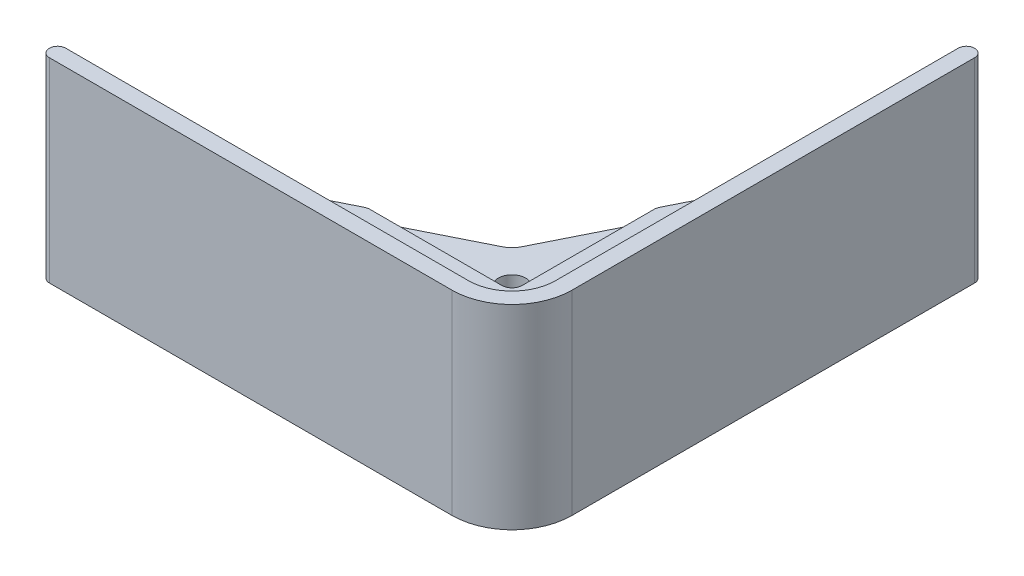
ISO-10303-21;
HEADER;
FILE_DESCRIPTION(('STEP AP214'),'2;1');
FILE_NAME('part.step','',(''),(''),'','','');
FILE_SCHEMA(('AUTOMOTIVE_DESIGN { 1 0 10303 214 1 1 1 1 }'));
ENDSEC;
DATA;
#1=APPLICATION_CONTEXT('core data for automotive mechanical design processes');
#2=APPLICATION_PROTOCOL_DEFINITION('international standard','automotive_design',2000,#1);
#3=PRODUCT_CONTEXT('',#1,'mechanical');
#4=PRODUCT('Part','Part','',(#3));
#5=PRODUCT_RELATED_PRODUCT_CATEGORY('part','',(#4));
#6=PRODUCT_DEFINITION_FORMATION('','',#4);
#7=PRODUCT_DEFINITION_CONTEXT('part definition',#1,'design');
#8=PRODUCT_DEFINITION('design','',#6,#7);
#9=PRODUCT_DEFINITION_SHAPE('','',#8);
#10=(LENGTH_UNIT() NAMED_UNIT(*) SI_UNIT(.MILLI.,.METRE.));
#11=(NAMED_UNIT(*) PLANE_ANGLE_UNIT() SI_UNIT($,.RADIAN.));
#12=(NAMED_UNIT(*) SI_UNIT($,.STERADIAN.) SOLID_ANGLE_UNIT());
#13=UNCERTAINTY_MEASURE_WITH_UNIT(LENGTH_MEASURE(1.E-05),#10,'distance_accuracy_value','');
#14=(GEOMETRIC_REPRESENTATION_CONTEXT(3) GLOBAL_UNCERTAINTY_ASSIGNED_CONTEXT((#13)) GLOBAL_UNIT_ASSIGNED_CONTEXT((#10,
#11,#12)) REPRESENTATION_CONTEXT('',''));
#15=CARTESIAN_POINT('',(0.,0.,0.));
#16=DIRECTION('',(0.,0.,1.));
#17=DIRECTION('',(1.,0.,0.));
#18=AXIS2_PLACEMENT_3D('',#15,#16,#17);
#19=CARTESIAN_POINT('',(0.,50.8,0.));
#20=DIRECTION('',(0.,-1.,0.));
#21=DIRECTION('',(0.,0.,-1.));
#22=AXIS2_PLACEMENT_3D('',#19,#20,#21);
#23=CYLINDRICAL_SURFACE('',#22,4.28625);
#24=CARTESIAN_POINT('',(0.,0.,0.));
#25=DIRECTION('',(0.,1.,0.));
#26=DIRECTION('',(0.,0.,1.));
#27=AXIS2_PLACEMENT_3D('',#24,#25,#26);
#28=CIRCLE('',#27,4.28625);
#29=CARTESIAN_POINT('',(0.,0.,4.28625));
#30=VERTEX_POINT('',#29);
#31=EDGE_CURVE('E287',#30,#30,#28,.T.);
#32=ORIENTED_EDGE('',*,*,#31,.F.);
#33=EDGE_LOOP('',(#32));
#34=FACE_BOUND('',#33,.T.);
#35=CARTESIAN_POINT('',(0.,47.371,0.));
#36=DIRECTION('',(0.,1.,0.));
#37=DIRECTION('',(0.,0.,1.));
#38=AXIS2_PLACEMENT_3D('',#35,#36,#37);
#39=CIRCLE('',#38,4.28625);
#40=CARTESIAN_POINT('',(0.,47.371,4.28625));
#41=VERTEX_POINT('',#40);
#42=EDGE_CURVE('E273',#41,#41,#39,.T.);
#43=ORIENTED_EDGE('',*,*,#42,.T.);
#44=EDGE_LOOP('',(#43));
#45=FACE_BOUND('',#44,.T.);
#46=ADVANCED_FACE('F39',(#34,#45),#23,.F.);
#47=CARTESIAN_POINT('',(-12.0476063758865,50.8,-6.00671496008418));
#48=DIRECTION('',(-0.894934361602028,0.,-0.446197813109804));
#49=DIRECTION('',(-0.446197813109804,0.,0.894934361602028));
#50=AXIS2_PLACEMENT_3D('',#47,#48,#49);
#51=PLANE('',#50);
#52=DIRECTION('',(0.446197813109804,0.,-0.894934361602028));
#53=VECTOR('',#52,1.);
#54=CARTESIAN_POINT('',(-12.0476063758865,0.,-6.00671496008418));
#55=LINE('',#54,#53);
#56=CARTESIAN_POINT('',(-9.08975997068408,0.,-11.9392370536097));
#57=VERTEX_POINT('',#56);
#58=CARTESIAN_POINT('',(12.7948331961729,0.,-55.832940337811));
#59=VERTEX_POINT('',#58);
#60=EDGE_CURVE('E282',#57,#59,#55,.T.);
#61=ORIENTED_EDGE('',*,*,#60,.F.);
#62=DIRECTION('',(0.,-1.,0.));
#63=VECTOR('',#62,1.);
#64=CARTESIAN_POINT('',(-9.08975997068408,50.8,-11.9392370536097));
#65=LINE('',#64,#63);
#66=CARTESIAN_POINT('',(-9.08975997068408,47.371,-11.9392370536097));
#67=VERTEX_POINT('',#66);
#68=EDGE_CURVE('E346',#57,#67,#65,.F.);
#69=ORIENTED_EDGE('',*,*,#68,.T.);
#70=DIRECTION('',(0.446197813109804,0.,-0.894934361602028));
#71=VECTOR('',#70,1.);
#72=CARTESIAN_POINT('',(-12.0476063758865,47.371,-6.00671496008418));
#73=LINE('',#72,#71);
#74=CARTESIAN_POINT('',(5.15958340191356,47.371,-40.5189984054781));
#75=VERTEX_POINT('',#74);
#76=EDGE_CURVE('E280',#67,#75,#73,.T.);
#77=ORIENTED_EDGE('',*,*,#76,.T.);
#78=DIRECTION('',(0.,1.,0.));
#79=VECTOR('',#78,1.);
#80=CARTESIAN_POINT('',(5.15958340191356,50.8,-40.5189984054781));
#81=LINE('',#80,#79);
#82=CARTESIAN_POINT('',(5.15958340191356,50.8,-40.5189984054781));
#83=VERTEX_POINT('',#82);
#84=EDGE_CURVE('E198',#75,#83,#81,.T.);
#85=ORIENTED_EDGE('',*,*,#84,.T.);
#86=DIRECTION('',(0.446197813109804,0.,-0.894934361602028));
#87=VECTOR('',#86,1.);
#88=CARTESIAN_POINT('',(-12.0476063758865,50.8,-6.00671496008418));
#89=LINE('',#88,#87);
#90=CARTESIAN_POINT('',(12.7948331961729,50.8,-55.832940337811));
#91=VERTEX_POINT('',#90);
#92=EDGE_CURVE('E283',#83,#91,#89,.T.);
#93=ORIENTED_EDGE('',*,*,#92,.T.);
#94=DIRECTION('',(0.,-1.,0.));
#95=VECTOR('',#94,1.);
#96=CARTESIAN_POINT('',(12.7948331961729,0.,-55.832940337811));
#97=LINE('',#96,#95);
#98=EDGE_CURVE('E343',#91,#59,#97,.T.);
#99=ORIENTED_EDGE('',*,*,#98,.T.);
#100=EDGE_LOOP('',(#61,#69,#77,#85,#93,#99));
#101=FACE_BOUND('',#100,.T.);
#102=ADVANCED_FACE('F409',(#101),#51,.T.);
#103=CARTESIAN_POINT('',(-6.00671496008417,50.8,-12.0476063758865));
#104=DIRECTION('',(0.446197813109803,0.,0.894934361602028));
#105=DIRECTION('',(0.894934361602028,0.,-0.446197813109804));
#106=AXIS2_PLACEMENT_3D('',#103,#104,#105);
#107=PLANE('',#106);
#108=DIRECTION('',(-0.894934361602028,0.,0.446197813109804));
#109=VECTOR('',#108,1.);
#110=CARTESIAN_POINT('',(-6.00671496008417,47.371,-12.0476063758865));
#111=LINE('',#110,#109);
#112=CARTESIAN_POINT('',(-11.9392370536097,47.371,-9.08975997068407));
#113=VERTEX_POINT('',#112);
#114=CARTESIAN_POINT('',(-40.5189984054781,47.371,5.15958340191357));
#115=VERTEX_POINT('',#114);
#116=EDGE_CURVE('E278',#113,#115,#111,.T.);
#117=ORIENTED_EDGE('',*,*,#116,.F.);
#118=DIRECTION('',(0.,-1.,0.));
#119=VECTOR('',#118,1.);
#120=CARTESIAN_POINT('',(-11.9392370536097,50.8,-9.08975997068407));
#121=LINE('',#120,#119);
#122=CARTESIAN_POINT('',(-11.9392370536097,0.,-9.08975997068407));
#123=VERTEX_POINT('',#122);
#124=EDGE_CURVE('E340',#113,#123,#121,.T.);
#125=ORIENTED_EDGE('',*,*,#124,.T.);
#126=DIRECTION('',(-0.894934361602028,0.,0.446197813109804));
#127=VECTOR('',#126,1.);
#128=CARTESIAN_POINT('',(-6.00671496008417,0.,-12.0476063758865));
#129=LINE('',#128,#127);
#130=CARTESIAN_POINT('',(-55.832940337811,0.,12.7948331961729));
#131=VERTEX_POINT('',#130);
#132=EDGE_CURVE('E293',#123,#131,#129,.T.);
#133=ORIENTED_EDGE('',*,*,#132,.T.);
#134=DIRECTION('',(0.,-1.,0.));
#135=VECTOR('',#134,1.);
#136=CARTESIAN_POINT('',(-55.832940337811,50.8,12.7948331961729));
#137=LINE('',#136,#135);
#138=CARTESIAN_POINT('',(-55.832940337811,50.8,12.7948331961729));
#139=VERTEX_POINT('',#138);
#140=EDGE_CURVE('E338',#131,#139,#137,.F.);
#141=ORIENTED_EDGE('',*,*,#140,.T.);
#142=DIRECTION('',(-0.894934361602028,0.,0.446197813109804));
#143=VECTOR('',#142,1.);
#144=CARTESIAN_POINT('',(-6.00671496008417,50.8,-12.0476063758865));
#145=LINE('',#144,#143);
#146=CARTESIAN_POINT('',(-40.5189984054781,50.8,5.15958340191357));
#147=VERTEX_POINT('',#146);
#148=EDGE_CURVE('E286',#147,#139,#145,.T.);
#149=ORIENTED_EDGE('',*,*,#148,.F.);
#150=DIRECTION('',(0.,1.,0.));
#151=VECTOR('',#150,1.);
#152=CARTESIAN_POINT('',(-40.5189984054781,50.8,5.15958340191357));
#153=LINE('',#152,#151);
#154=EDGE_CURVE('E325',#147,#115,#153,.F.);
#155=ORIENTED_EDGE('',*,*,#154,.T.);
#156=EDGE_LOOP('',(#117,#125,#133,#141,#149,#155));
#157=FACE_BOUND('',#156,.T.);
#158=ADVANCED_FACE('F401',(#157),#107,.F.);
#159=CARTESIAN_POINT('',(0.,50.8,13.462));
#160=DIRECTION('',(0.,0.,-1.));
#161=DIRECTION('',(-1.,0.,0.));
#162=AXIS2_PLACEMENT_3D('',#159,#160,#161);
#163=PLANE('',#162);
#164=DIRECTION('',(0.,-1.,0.));
#165=VECTOR('',#164,1.);
#166=CARTESIAN_POINT('',(-58.6662964510583,50.8,13.462));
#167=LINE('',#166,#165);
#168=CARTESIAN_POINT('',(-58.6662964510583,50.8,13.462));
#169=VERTEX_POINT('',#168);
#170=CARTESIAN_POINT('',(-58.6662964510583,0.,13.462));
#171=VERTEX_POINT('',#170);
#172=EDGE_CURVE('E348',#169,#171,#167,.T.);
#173=ORIENTED_EDGE('',*,*,#172,.T.);
#174=DIRECTION('',(1.,0.,0.));
#175=VECTOR('',#174,1.);
#176=CARTESIAN_POINT('',(0.,0.,13.462));
#177=LINE('',#176,#175);
#178=CARTESIAN_POINT('',(0.,0.,13.462));
#179=VERTEX_POINT('',#178);
#180=EDGE_CURVE('E256',#171,#179,#177,.T.);
#181=ORIENTED_EDGE('',*,*,#180,.T.);
#182=DIRECTION('',(0.,-1.,0.));
#183=VECTOR('',#182,1.);
#184=CARTESIAN_POINT('',(0.,55.5625,13.462));
#185=LINE('',#184,#183);
#186=CARTESIAN_POINT('',(0.,-4.7625,13.462));
#187=VERTEX_POINT('',#186);
#188=EDGE_CURVE('E229',#179,#187,#185,.T.);
#189=ORIENTED_EDGE('',*,*,#188,.T.);
#190=DIRECTION('',(-1.,0.,0.));
#191=VECTOR('',#190,1.);
#192=CARTESIAN_POINT('',(0.,-4.7625,13.462));
#193=LINE('',#192,#191);
#194=CARTESIAN_POINT('',(-124.46,-4.7625,13.462));
#195=VERTEX_POINT('',#194);
#196=EDGE_CURVE('E214',#187,#195,#193,.T.);
#197=ORIENTED_EDGE('',*,*,#196,.T.);
#198=DIRECTION('',(0.,-1.,0.));
#199=VECTOR('',#198,1.);
#200=CARTESIAN_POINT('',(-124.46,50.8,13.462));
#201=LINE('',#200,#199);
#202=CARTESIAN_POINT('',(-124.46,55.5625,13.462));
#203=VERTEX_POINT('',#202);
#204=EDGE_CURVE('E199',#195,#203,#201,.F.);
#205=ORIENTED_EDGE('',*,*,#204,.T.);
#206=DIRECTION('',(-1.,0.,0.));
#207=VECTOR('',#206,1.);
#208=CARTESIAN_POINT('',(0.,55.5625,13.462));
#209=LINE('',#208,#207);
#210=CARTESIAN_POINT('',(0.,55.5625,13.462));
#211=VERTEX_POINT('',#210);
#212=EDGE_CURVE('E212',#211,#203,#209,.T.);
#213=ORIENTED_EDGE('',*,*,#212,.F.);
#214=CARTESIAN_POINT('',(0.,50.8,13.462));
#215=VERTEX_POINT('',#214);
#216=EDGE_CURVE('E249',#211,#215,#185,.T.);
#217=ORIENTED_EDGE('',*,*,#216,.T.);
#218=DIRECTION('',(1.,0.,0.));
#219=VECTOR('',#218,1.);
#220=CARTESIAN_POINT('',(0.,50.8,13.462));
#221=LINE('',#220,#219);
#222=EDGE_CURVE('E259',#169,#215,#221,.T.);
#223=ORIENTED_EDGE('',*,*,#222,.F.);
#224=EDGE_LOOP('',(#173,#181,#189,#197,#205,#213,#217,#223));
#225=FACE_BOUND('',#224,.T.);
#226=ADVANCED_FACE('F392',(#225),#163,.T.);
#227=CARTESIAN_POINT('',(0.,50.8,18.542));
#228=DIRECTION('',(0.,0.,1.));
#229=DIRECTION('',(1.,0.,0.));
#230=AXIS2_PLACEMENT_3D('',#227,#228,#229);
#231=PLANE('',#230);
#232=DIRECTION('',(0.,-1.,0.));
#233=VECTOR('',#232,1.);
#234=CARTESIAN_POINT('',(0.,50.8,18.542));
#235=LINE('',#234,#233);
#236=CARTESIAN_POINT('',(0.,55.5625,18.542));
#237=VERTEX_POINT('',#236);
#238=CARTESIAN_POINT('',(0.,-4.7625,18.542));
#239=VERTEX_POINT('',#238);
#240=EDGE_CURVE('E204',#237,#239,#235,.T.);
#241=ORIENTED_EDGE('',*,*,#240,.F.);
#242=DIRECTION('',(1.,0.,0.));
#243=VECTOR('',#242,1.);
#244=CARTESIAN_POINT('',(-124.46,55.5625,18.542));
#245=LINE('',#244,#243);
#246=CARTESIAN_POINT('',(-124.46,55.5625,18.542));
#247=VERTEX_POINT('',#246);
#248=EDGE_CURVE('E202',#247,#237,#245,.T.);
#249=ORIENTED_EDGE('',*,*,#248,.F.);
#250=DIRECTION('',(0.,-1.,0.));
#251=VECTOR('',#250,1.);
#252=CARTESIAN_POINT('',(-124.46,50.8,18.542));
#253=LINE('',#252,#251);
#254=CARTESIAN_POINT('',(-124.46,-4.7625,18.542));
#255=VERTEX_POINT('',#254);
#256=EDGE_CURVE('E187',#247,#255,#253,.T.);
#257=ORIENTED_EDGE('',*,*,#256,.T.);
#258=DIRECTION('',(1.,0.,0.));
#259=VECTOR('',#258,1.);
#260=CARTESIAN_POINT('',(-124.46,-4.7625,18.542));
#261=LINE('',#260,#259);
#262=EDGE_CURVE('E230',#255,#239,#261,.T.);
#263=ORIENTED_EDGE('',*,*,#262,.T.);
#264=EDGE_LOOP('',(#241,#249,#257,#263));
#265=FACE_BOUND('',#264,.T.);
#266=ADVANCED_FACE('F203',(#265),#231,.T.);
#267=CARTESIAN_POINT('',(0.,50.8,0.));
#268=DIRECTION('',(0.,-1.,0.));
#269=DIRECTION('',(0.,0.,-1.));
#270=AXIS2_PLACEMENT_3D('',#267,#268,#269);
#271=CYLINDRICAL_SURFACE('',#270,18.542);
#272=ORIENTED_EDGE('',*,*,#240,.T.);
#273=CARTESIAN_POINT('',(0.,-4.7625,0.));
#274=DIRECTION('',(0.,1.,0.));
#275=DIRECTION('',(0.,0.,1.));
#276=AXIS2_PLACEMENT_3D('',#273,#274,#275);
#277=CIRCLE('',#276,18.542);
#278=CARTESIAN_POINT('',(18.542,-4.7625,0.));
#279=VERTEX_POINT('',#278);
#280=EDGE_CURVE('E232',#239,#279,#277,.T.);
#281=ORIENTED_EDGE('',*,*,#280,.T.);
#282=DIRECTION('',(0.,-1.,0.));
#283=VECTOR('',#282,1.);
#284=CARTESIAN_POINT('',(18.542,50.8,0.));
#285=LINE('',#284,#283);
#286=CARTESIAN_POINT('',(18.542,55.5625,0.));
#287=VERTEX_POINT('',#286);
#288=EDGE_CURVE('E290',#287,#279,#285,.T.);
#289=ORIENTED_EDGE('',*,*,#288,.F.);
#290=CARTESIAN_POINT('',(0.,55.5625,0.));
#291=DIRECTION('',(0.,1.,0.));
#292=DIRECTION('',(0.,0.,1.));
#293=AXIS2_PLACEMENT_3D('',#290,#291,#292);
#294=CIRCLE('',#293,18.542);
#295=EDGE_CURVE('E208',#237,#287,#294,.T.);
#296=ORIENTED_EDGE('',*,*,#295,.F.);
#297=EDGE_LOOP('',(#272,#281,#289,#296));
#298=FACE_BOUND('',#297,.T.);
#299=ADVANCED_FACE('F465',(#298),#271,.T.);
#300=CARTESIAN_POINT('',(18.542,50.8,0.));
#301=DIRECTION('',(-1.,0.,0.));
#302=DIRECTION('',(0.,0.,1.));
#303=AXIS2_PLACEMENT_3D('',#300,#301,#302);
#304=PLANE('',#303);
#305=ORIENTED_EDGE('',*,*,#288,.T.);
#306=DIRECTION('',(0.,0.,-1.));
#307=VECTOR('',#306,1.);
#308=CARTESIAN_POINT('',(18.542,-4.7625,0.));
#309=LINE('',#308,#307);
#310=CARTESIAN_POINT('',(18.542,-4.7625,-124.46));
#311=VERTEX_POINT('',#310);
#312=EDGE_CURVE('E235',#279,#311,#309,.T.);
#313=ORIENTED_EDGE('',*,*,#312,.T.);
#314=DIRECTION('',(0.,-1.,0.));
#315=VECTOR('',#314,1.);
#316=CARTESIAN_POINT('',(18.542,50.8,-124.46));
#317=LINE('',#316,#315);
#318=CARTESIAN_POINT('',(18.542,55.5625,-124.46));
#319=VERTEX_POINT('',#318);
#320=EDGE_CURVE('E302',#311,#319,#317,.F.);
#321=ORIENTED_EDGE('',*,*,#320,.T.);
#322=DIRECTION('',(0.,0.,-1.));
#323=VECTOR('',#322,1.);
#324=CARTESIAN_POINT('',(18.542,55.5625,0.));
#325=LINE('',#324,#323);
#326=EDGE_CURVE('E218',#287,#319,#325,.T.);
#327=ORIENTED_EDGE('',*,*,#326,.F.);
#328=EDGE_LOOP('',(#305,#313,#321,#327));
#329=FACE_BOUND('',#328,.T.);
#330=ADVANCED_FACE('F462',(#329),#304,.F.);
#331=CARTESIAN_POINT('',(13.462,50.8,0.));
#332=DIRECTION('',(-1.,0.,0.));
#333=DIRECTION('',(0.,0.,1.));
#334=AXIS2_PLACEMENT_3D('',#331,#332,#333);
#335=PLANE('',#334);
#336=DIRECTION('',(0.,0.,-1.));
#337=VECTOR('',#336,1.);
#338=CARTESIAN_POINT('',(13.462,0.,0.));
#339=LINE('',#338,#337);
#340=CARTESIAN_POINT('',(13.462,0.,0.));
#341=VERTEX_POINT('',#340);
#342=CARTESIAN_POINT('',(13.462,0.,-58.6662964510582));
#343=VERTEX_POINT('',#342);
#344=EDGE_CURVE('E54',#341,#343,#339,.T.);
#345=ORIENTED_EDGE('',*,*,#344,.T.);
#346=DIRECTION('',(0.,-1.,0.));
#347=VECTOR('',#346,1.);
#348=CARTESIAN_POINT('',(13.462,50.8,-58.6662964510582));
#349=LINE('',#348,#347);
#350=CARTESIAN_POINT('',(13.462,50.8,-58.6662964510582));
#351=VERTEX_POINT('',#350);
#352=EDGE_CURVE('E351',#343,#351,#349,.F.);
#353=ORIENTED_EDGE('',*,*,#352,.T.);
#354=DIRECTION('',(0.,0.,-1.));
#355=VECTOR('',#354,1.);
#356=CARTESIAN_POINT('',(13.462,50.8,0.));
#357=LINE('',#356,#355);
#358=CARTESIAN_POINT('',(13.462,50.8,0.));
#359=VERTEX_POINT('',#358);
#360=EDGE_CURVE('E61',#359,#351,#357,.T.);
#361=ORIENTED_EDGE('',*,*,#360,.F.);
#362=DIRECTION('',(0.,-1.,0.));
#363=VECTOR('',#362,1.);
#364=CARTESIAN_POINT('',(13.462,55.5625,0.));
#365=LINE('',#364,#363);
#366=CARTESIAN_POINT('',(13.462,55.5625,0.));
#367=VERTEX_POINT('',#366);
#368=EDGE_CURVE('E253',#367,#359,#365,.T.);
#369=ORIENTED_EDGE('',*,*,#368,.F.);
#370=DIRECTION('',(0.,0.,1.));
#371=VECTOR('',#370,1.);
#372=CARTESIAN_POINT('',(13.462,55.5625,-124.46));
#373=LINE('',#372,#371);
#374=CARTESIAN_POINT('',(13.462,55.5625,-124.46));
#375=VERTEX_POINT('',#374);
#376=EDGE_CURVE('E224',#375,#367,#373,.T.);
#377=ORIENTED_EDGE('',*,*,#376,.F.);
#378=DIRECTION('',(0.,-1.,0.));
#379=VECTOR('',#378,1.);
#380=CARTESIAN_POINT('',(13.462,50.8,-124.46));
#381=LINE('',#380,#379);
#382=CARTESIAN_POINT('',(13.462,-4.7625,-124.46));
#383=VERTEX_POINT('',#382);
#384=EDGE_CURVE('E300',#375,#383,#381,.T.);
#385=ORIENTED_EDGE('',*,*,#384,.T.);
#386=DIRECTION('',(0.,0.,1.));
#387=VECTOR('',#386,1.);
#388=CARTESIAN_POINT('',(13.462,-4.7625,-124.46));
#389=LINE('',#388,#387);
#390=CARTESIAN_POINT('',(13.462,-4.7625,0.));
#391=VERTEX_POINT('',#390);
#392=EDGE_CURVE('E241',#383,#391,#389,.T.);
#393=ORIENTED_EDGE('',*,*,#392,.T.);
#394=EDGE_CURVE('E252',#341,#391,#365,.T.);
#395=ORIENTED_EDGE('',*,*,#394,.F.);
#396=EDGE_LOOP('',(#345,#353,#361,#369,#377,#385,#393,#395));
#397=FACE_BOUND('',#396,.T.);
#398=ADVANCED_FACE('F369',(#397),#335,.T.);
#399=CARTESIAN_POINT('',(0.,50.8,0.));
#400=DIRECTION('',(0.,1.,0.));
#401=DIRECTION('',(0.,0.,1.));
#402=AXIS2_PLACEMENT_3D('',#399,#400,#401);
#403=PLANE('',#402);
#404=CARTESIAN_POINT('',(0.,50.8,0.));
#405=DIRECTION('',(0.,1.,0.));
#406=DIRECTION('',(0.,0.,1.));
#407=AXIS2_PLACEMENT_3D('',#404,#405,#406);
#408=CIRCLE('',#407,13.462);
#409=EDGE_CURVE('E263',#215,#359,#408,.T.);
#410=ORIENTED_EDGE('',*,*,#409,.T.);
#411=ORIENTED_EDGE('',*,*,#360,.T.);
#412=CARTESIAN_POINT('',(7.112,50.8,-58.6662964510582));
#413=DIRECTION('',(0.,1.,0.));
#414=DIRECTION('',(0.,0.,1.));
#415=AXIS2_PLACEMENT_3D('',#412,#413,#414);
#416=CIRCLE('',#415,6.35);
#417=EDGE_CURVE('E11',#351,#91,#416,.F.);
#418=ORIENTED_EDGE('',*,*,#417,.T.);
#419=ORIENTED_EDGE('',*,*,#92,.F.);
#420=CARTESIAN_POINT('',(8.001,50.8,-39.1023203488544));
#421=DIRECTION('',(0.,1.,0.));
#422=DIRECTION('',(0.,0.,1.));
#423=AXIS2_PLACEMENT_3D('',#420,#421,#422);
#424=CIRCLE('',#423,3.175);
#425=CARTESIAN_POINT('',(4.826,50.8,-39.1023203488544));
#426=VERTEX_POINT('',#425);
#427=EDGE_CURVE('E311',#83,#426,#424,.T.);
#428=ORIENTED_EDGE('',*,*,#427,.T.);
#429=DIRECTION('',(0.,0.,-1.));
#430=VECTOR('',#429,1.);
#431=CARTESIAN_POINT('',(4.826,50.8,4.826));
#432=LINE('',#431,#430);
#433=CARTESIAN_POINT('',(4.826,50.8,1.651));
#434=VERTEX_POINT('',#433);
#435=EDGE_CURVE('E265',#434,#426,#432,.T.);
#436=ORIENTED_EDGE('',*,*,#435,.F.);
#437=CARTESIAN_POINT('',(1.651,50.8,1.651));
#438=DIRECTION('',(0.,1.,0.));
#439=DIRECTION('',(0.,0.,1.));
#440=AXIS2_PLACEMENT_3D('',#437,#438,#439);
#441=CIRCLE('',#440,3.175);
#442=CARTESIAN_POINT('',(1.651,50.8,4.826));
#443=VERTEX_POINT('',#442);
#444=EDGE_CURVE('E331',#434,#443,#441,.F.);
#445=ORIENTED_EDGE('',*,*,#444,.T.);
#446=DIRECTION('',(1.,0.,0.));
#447=VECTOR('',#446,1.);
#448=CARTESIAN_POINT('',(4.826,50.8,4.826));
#449=LINE('',#448,#447);
#450=CARTESIAN_POINT('',(-39.1023203488544,50.8,4.826));
#451=VERTEX_POINT('',#450);
#452=EDGE_CURVE('E270',#451,#443,#449,.T.);
#453=ORIENTED_EDGE('',*,*,#452,.F.);
#454=CARTESIAN_POINT('',(-39.1023203488544,50.8,8.001));
#455=DIRECTION('',(0.,1.,0.));
#456=DIRECTION('',(0.,0.,1.));
#457=AXIS2_PLACEMENT_3D('',#454,#455,#456);
#458=CIRCLE('',#457,3.175);
#459=EDGE_CURVE('E309',#451,#147,#458,.T.);
#460=ORIENTED_EDGE('',*,*,#459,.T.);
#461=ORIENTED_EDGE('',*,*,#148,.T.);
#462=CARTESIAN_POINT('',(-58.6662964510583,50.8,7.112));
#463=DIRECTION('',(0.,1.,0.));
#464=DIRECTION('',(0.,0.,1.));
#465=AXIS2_PLACEMENT_3D('',#462,#463,#464);
#466=CIRCLE('',#465,6.35);
#467=EDGE_CURVE('E359',#139,#169,#466,.F.);
#468=ORIENTED_EDGE('',*,*,#467,.T.);
#469=ORIENTED_EDGE('',*,*,#222,.T.);
#470=EDGE_LOOP('',(#410,#411,#418,#419,#428,#436,#445,#453,#460,#461,#468,#469));
#471=FACE_BOUND('',#470,.T.);
#472=ADVANCED_FACE('F413',(#471),#403,.T.);
#473=CARTESIAN_POINT('',(0.,0.,0.));
#474=DIRECTION('',(0.,1.,0.));
#475=DIRECTION('',(0.,0.,1.));
#476=AXIS2_PLACEMENT_3D('',#473,#474,#475);
#477=PLANE('',#476);
#478=ORIENTED_EDGE('',*,*,#344,.F.);
#479=CARTESIAN_POINT('',(0.,0.,0.));
#480=DIRECTION('',(0.,1.,0.));
#481=DIRECTION('',(0.,0.,1.));
#482=AXIS2_PLACEMENT_3D('',#479,#480,#481);
#483=CIRCLE('',#482,13.462);
#484=EDGE_CURVE('E335',#179,#341,#483,.T.);
#485=ORIENTED_EDGE('',*,*,#484,.F.);
#486=ORIENTED_EDGE('',*,*,#180,.F.);
#487=CARTESIAN_POINT('',(-58.6662964510583,0.,7.112));
#488=DIRECTION('',(0.,1.,0.));
#489=DIRECTION('',(0.,0.,1.));
#490=AXIS2_PLACEMENT_3D('',#487,#488,#489);
#491=CIRCLE('',#490,6.35);
#492=EDGE_CURVE('E357',#171,#131,#491,.T.);
#493=ORIENTED_EDGE('',*,*,#492,.T.);
#494=ORIENTED_EDGE('',*,*,#132,.F.);
#495=CARTESIAN_POINT('',(-14.772593166857,0.,-14.7725931668569));
#496=DIRECTION('',(0.,1.,0.));
#497=DIRECTION('',(0.,0.,1.));
#498=AXIS2_PLACEMENT_3D('',#495,#496,#497);
#499=CIRCLE('',#498,6.35);
#500=EDGE_CURVE('E353',#123,#57,#499,.T.);
#501=ORIENTED_EDGE('',*,*,#500,.T.);
#502=ORIENTED_EDGE('',*,*,#60,.T.);
#503=CARTESIAN_POINT('',(7.112,0.,-58.6662964510582));
#504=DIRECTION('',(0.,1.,0.));
#505=DIRECTION('',(0.,0.,1.));
#506=AXIS2_PLACEMENT_3D('',#503,#504,#505);
#507=CIRCLE('',#506,6.35);
#508=EDGE_CURVE('E47',#59,#343,#507,.T.);
#509=ORIENTED_EDGE('',*,*,#508,.T.);
#510=EDGE_LOOP('',(#478,#485,#486,#493,#494,#501,#502,#509));
#511=FACE_BOUND('',#510,.T.);
#512=ORIENTED_EDGE('',*,*,#31,.T.);
#513=EDGE_LOOP('',(#512));
#514=FACE_BOUND('',#513,.T.);
#515=ADVANCED_FACE('F363',(#511,#514),#477,.F.);
#516=CARTESIAN_POINT('',(16.002,50.8,-124.46));
#517=DIRECTION('',(0.,1.,0.));
#518=DIRECTION('',(0.,0.,1.));
#519=AXIS2_PLACEMENT_3D('',#516,#517,#518);
#520=CYLINDRICAL_SURFACE('',#519,2.54);
#521=ORIENTED_EDGE('',*,*,#384,.F.);
#522=CARTESIAN_POINT('',(16.002,55.5625,-124.46));
#523=DIRECTION('',(0.,1.,0.));
#524=DIRECTION('',(0.,0.,1.));
#525=AXIS2_PLACEMENT_3D('',#522,#523,#524);
#526=CIRCLE('',#525,2.54);
#527=EDGE_CURVE('E221',#319,#375,#526,.T.);
#528=ORIENTED_EDGE('',*,*,#527,.F.);
#529=ORIENTED_EDGE('',*,*,#320,.F.);
#530=CARTESIAN_POINT('',(16.002,-4.7625,-124.46));
#531=DIRECTION('',(0.,1.,0.));
#532=DIRECTION('',(0.,0.,1.));
#533=AXIS2_PLACEMENT_3D('',#530,#531,#532);
#534=CIRCLE('',#533,2.54);
#535=EDGE_CURVE('E238',#311,#383,#534,.T.);
#536=ORIENTED_EDGE('',*,*,#535,.T.);
#537=EDGE_LOOP('',(#521,#528,#529,#536));
#538=FACE_BOUND('',#537,.T.);
#539=ADVANCED_FACE('F382',(#538),#520,.T.);
#540=CARTESIAN_POINT('',(-124.46,50.8,16.002));
#541=DIRECTION('',(0.,-1.,0.));
#542=DIRECTION('',(0.,0.,-1.));
#543=AXIS2_PLACEMENT_3D('',#540,#541,#542);
#544=CYLINDRICAL_SURFACE('',#543,2.54);
#545=ORIENTED_EDGE('',*,*,#256,.F.);
#546=CARTESIAN_POINT('',(-124.46,55.5625,16.002));
#547=DIRECTION('',(0.,1.,0.));
#548=DIRECTION('',(0.,0.,1.));
#549=AXIS2_PLACEMENT_3D('',#546,#547,#548);
#550=CIRCLE('',#549,2.54);
#551=EDGE_CURVE('E191',#203,#247,#550,.T.);
#552=ORIENTED_EDGE('',*,*,#551,.F.);
#553=ORIENTED_EDGE('',*,*,#204,.F.);
#554=CARTESIAN_POINT('',(-124.46,-4.7625,16.002));
#555=DIRECTION('',(0.,1.,0.));
#556=DIRECTION('',(0.,0.,1.));
#557=AXIS2_PLACEMENT_3D('',#554,#555,#556);
#558=CIRCLE('',#557,2.54);
#559=EDGE_CURVE('E194',#195,#255,#558,.T.);
#560=ORIENTED_EDGE('',*,*,#559,.T.);
#561=EDGE_LOOP('',(#545,#552,#553,#560));
#562=FACE_BOUND('',#561,.T.);
#563=ADVANCED_FACE('F189',(#562),#544,.T.);
#564=CARTESIAN_POINT('',(4.826,47.371,4.826));
#565=DIRECTION('',(1.,0.,0.));
#566=DIRECTION('',(0.,0.,-1.));
#567=AXIS2_PLACEMENT_3D('',#564,#565,#566);
#568=PLANE('',#567);
#569=ORIENTED_EDGE('',*,*,#435,.T.);
#570=DIRECTION('',(0.,1.,0.));
#571=VECTOR('',#570,1.);
#572=CARTESIAN_POINT('',(4.826,47.371,-39.1023203488544));
#573=LINE('',#572,#571);
#574=CARTESIAN_POINT('',(4.826,47.371,-39.1023203488544));
#575=VERTEX_POINT('',#574);
#576=EDGE_CURVE('E316',#426,#575,#573,.F.);
#577=ORIENTED_EDGE('',*,*,#576,.T.);
#578=DIRECTION('',(0.,0.,-1.));
#579=VECTOR('',#578,1.);
#580=CARTESIAN_POINT('',(4.826,47.371,4.826));
#581=LINE('',#580,#579);
#582=CARTESIAN_POINT('',(4.826,47.371,1.651));
#583=VERTEX_POINT('',#582);
#584=EDGE_CURVE('E266',#583,#575,#581,.T.);
#585=ORIENTED_EDGE('',*,*,#584,.F.);
#586=DIRECTION('',(0.,1.,0.));
#587=VECTOR('',#586,1.);
#588=CARTESIAN_POINT('',(4.826,50.8,1.651));
#589=LINE('',#588,#587);
#590=EDGE_CURVE('E313',#583,#434,#589,.T.);
#591=ORIENTED_EDGE('',*,*,#590,.T.);
#592=EDGE_LOOP('',(#569,#577,#585,#591));
#593=FACE_BOUND('',#592,.T.);
#594=ADVANCED_FACE('F418',(#593),#568,.F.);
#595=CARTESIAN_POINT('',(4.826,47.371,4.826));
#596=DIRECTION('',(0.,0.,1.));
#597=DIRECTION('',(1.,0.,0.));
#598=AXIS2_PLACEMENT_3D('',#595,#596,#597);
#599=PLANE('',#598);
#600=ORIENTED_EDGE('',*,*,#452,.T.);
#601=DIRECTION('',(0.,1.,0.));
#602=VECTOR('',#601,1.);
#603=CARTESIAN_POINT('',(1.651,47.371,4.826));
#604=LINE('',#603,#602);
#605=CARTESIAN_POINT('',(1.651,47.371,4.826));
#606=VERTEX_POINT('',#605);
#607=EDGE_CURVE('E321',#443,#606,#604,.F.);
#608=ORIENTED_EDGE('',*,*,#607,.T.);
#609=DIRECTION('',(1.,0.,0.));
#610=VECTOR('',#609,1.);
#611=CARTESIAN_POINT('',(4.826,47.371,4.826));
#612=LINE('',#611,#610);
#613=CARTESIAN_POINT('',(-39.1023203488544,47.371,4.826));
#614=VERTEX_POINT('',#613);
#615=EDGE_CURVE('E269',#614,#606,#612,.T.);
#616=ORIENTED_EDGE('',*,*,#615,.F.);
#617=DIRECTION('',(0.,1.,0.));
#618=VECTOR('',#617,1.);
#619=CARTESIAN_POINT('',(-39.1023203488544,47.371,4.826));
#620=LINE('',#619,#618);
#621=EDGE_CURVE('E318',#614,#451,#620,.T.);
#622=ORIENTED_EDGE('',*,*,#621,.T.);
#623=EDGE_LOOP('',(#600,#608,#616,#622));
#624=FACE_BOUND('',#623,.T.);
#625=ADVANCED_FACE('F431',(#624),#599,.F.);
#626=CARTESIAN_POINT('',(0.,47.371,0.));
#627=DIRECTION('',(0.,1.,0.));
#628=DIRECTION('',(0.,0.,1.));
#629=AXIS2_PLACEMENT_3D('',#626,#627,#628);
#630=PLANE('',#629);
#631=ORIENTED_EDGE('',*,*,#42,.F.);
#632=EDGE_LOOP('',(#631));
#633=FACE_BOUND('',#632,.T.);
#634=ORIENTED_EDGE('',*,*,#615,.T.);
#635=CARTESIAN_POINT('',(1.651,47.371,1.651));
#636=DIRECTION('',(0.,1.,0.));
#637=DIRECTION('',(0.,0.,1.));
#638=AXIS2_PLACEMENT_3D('',#635,#636,#637);
#639=CIRCLE('',#638,3.175);
#640=EDGE_CURVE('E323',#606,#583,#639,.T.);
#641=ORIENTED_EDGE('',*,*,#640,.T.);
#642=ORIENTED_EDGE('',*,*,#584,.T.);
#643=CARTESIAN_POINT('',(8.001,47.371,-39.1023203488544));
#644=DIRECTION('',(0.,1.,0.));
#645=DIRECTION('',(0.,0.,1.));
#646=AXIS2_PLACEMENT_3D('',#643,#644,#645);
#647=CIRCLE('',#646,3.175);
#648=EDGE_CURVE('E328',#575,#75,#647,.F.);
#649=ORIENTED_EDGE('',*,*,#648,.T.);
#650=ORIENTED_EDGE('',*,*,#76,.F.);
#651=CARTESIAN_POINT('',(-14.772593166857,47.371,-14.7725931668569));
#652=DIRECTION('',(0.,1.,0.));
#653=DIRECTION('',(0.,0.,1.));
#654=AXIS2_PLACEMENT_3D('',#651,#652,#653);
#655=CIRCLE('',#654,6.35);
#656=EDGE_CURVE('E355',#67,#113,#655,.F.);
#657=ORIENTED_EDGE('',*,*,#656,.T.);
#658=ORIENTED_EDGE('',*,*,#116,.T.);
#659=CARTESIAN_POINT('',(-39.1023203488544,47.371,8.001));
#660=DIRECTION('',(0.,1.,0.));
#661=DIRECTION('',(0.,0.,1.));
#662=AXIS2_PLACEMENT_3D('',#659,#660,#661);
#663=CIRCLE('',#662,3.175);
#664=EDGE_CURVE('E333',#115,#614,#663,.F.);
#665=ORIENTED_EDGE('',*,*,#664,.T.);
#666=EDGE_LOOP('',(#634,#641,#642,#649,#650,#657,#658,#665));
#667=FACE_BOUND('',#666,.T.);
#668=ADVANCED_FACE('F424',(#633,#667),#630,.T.);
#669=CARTESIAN_POINT('',(8.001,50.8,-39.1023203488544));
#670=DIRECTION('',(0.,-1.,0.));
#671=DIRECTION('',(0.,0.,-1.));
#672=AXIS2_PLACEMENT_3D('',#669,#670,#671);
#673=CYLINDRICAL_SURFACE('',#672,3.175);
#674=ORIENTED_EDGE('',*,*,#648,.F.);
#675=ORIENTED_EDGE('',*,*,#576,.F.);
#676=ORIENTED_EDGE('',*,*,#427,.F.);
#677=ORIENTED_EDGE('',*,*,#84,.F.);
#678=EDGE_LOOP('',(#674,#675,#676,#677));
#679=FACE_BOUND('',#678,.T.);
#680=ADVANCED_FACE('F422',(#679),#673,.T.);
#681=CARTESIAN_POINT('',(1.651,47.371,1.651));
#682=DIRECTION('',(0.,-1.,0.));
#683=DIRECTION('',(0.,0.,-1.));
#684=AXIS2_PLACEMENT_3D('',#681,#682,#683);
#685=CYLINDRICAL_SURFACE('',#684,3.175);
#686=ORIENTED_EDGE('',*,*,#640,.F.);
#687=ORIENTED_EDGE('',*,*,#607,.F.);
#688=ORIENTED_EDGE('',*,*,#444,.F.);
#689=ORIENTED_EDGE('',*,*,#590,.F.);
#690=EDGE_LOOP('',(#686,#687,#688,#689));
#691=FACE_BOUND('',#690,.T.);
#692=ADVANCED_FACE('F427',(#691),#685,.F.);
#693=CARTESIAN_POINT('',(-39.1023203488544,47.371,8.001));
#694=DIRECTION('',(0.,1.,0.));
#695=DIRECTION('',(0.,0.,1.));
#696=AXIS2_PLACEMENT_3D('',#693,#694,#695);
#697=CYLINDRICAL_SURFACE('',#696,3.175);
#698=ORIENTED_EDGE('',*,*,#664,.F.);
#699=ORIENTED_EDGE('',*,*,#154,.F.);
#700=ORIENTED_EDGE('',*,*,#459,.F.);
#701=ORIENTED_EDGE('',*,*,#621,.F.);
#702=EDGE_LOOP('',(#698,#699,#700,#701));
#703=FACE_BOUND('',#702,.T.);
#704=ADVANCED_FACE('F436',(#703),#697,.T.);
#705=CARTESIAN_POINT('',(-124.46,-4.7625,16.002));
#706=DIRECTION('',(0.,1.,0.));
#707=DIRECTION('',(0.,0.,1.));
#708=AXIS2_PLACEMENT_3D('',#705,#706,#707);
#709=PLANE('',#708);
#710=ORIENTED_EDGE('',*,*,#262,.F.);
#711=ORIENTED_EDGE('',*,*,#559,.F.);
#712=ORIENTED_EDGE('',*,*,#196,.F.);
#713=CARTESIAN_POINT('',(0.,-4.7625,0.));
#714=DIRECTION('',(0.,-1.,0.));
#715=DIRECTION('',(0.,0.,1.));
#716=AXIS2_PLACEMENT_3D('',#713,#714,#715);
#717=CIRCLE('',#716,13.462);
#718=EDGE_CURVE('E244',#391,#187,#717,.T.);
#719=ORIENTED_EDGE('',*,*,#718,.F.);
#720=ORIENTED_EDGE('',*,*,#392,.F.);
#721=ORIENTED_EDGE('',*,*,#535,.F.);
#722=ORIENTED_EDGE('',*,*,#312,.F.);
#723=ORIENTED_EDGE('',*,*,#280,.F.);
#724=EDGE_LOOP('',(#710,#711,#712,#719,#720,#721,#722,#723));
#725=FACE_BOUND('',#724,.T.);
#726=ADVANCED_FACE('F385',(#725),#709,.F.);
#727=CARTESIAN_POINT('',(0.,55.5625,0.));
#728=DIRECTION('',(0.,-1.,0.));
#729=DIRECTION('',(0.,0.,-1.));
#730=AXIS2_PLACEMENT_3D('',#727,#728,#729);
#731=CYLINDRICAL_SURFACE('',#730,13.462);
#732=ORIENTED_EDGE('',*,*,#188,.F.);
#733=ORIENTED_EDGE('',*,*,#484,.T.);
#734=ORIENTED_EDGE('',*,*,#394,.T.);
#735=ORIENTED_EDGE('',*,*,#718,.T.);
#736=EDGE_LOOP('',(#732,#733,#734,#735));
#737=FACE_BOUND('',#736,.T.);
#738=ADVANCED_FACE('F389',(#737),#731,.F.);
#739=ORIENTED_EDGE('',*,*,#409,.F.);
#740=ORIENTED_EDGE('',*,*,#216,.F.);
#741=CARTESIAN_POINT('',(0.,55.5625,0.));
#742=DIRECTION('',(0.,-1.,0.));
#743=DIRECTION('',(0.,0.,1.));
#744=AXIS2_PLACEMENT_3D('',#741,#742,#743);
#745=CIRCLE('',#744,13.462);
#746=EDGE_CURVE('E226',#367,#211,#745,.T.);
#747=ORIENTED_EDGE('',*,*,#746,.F.);
#748=ORIENTED_EDGE('',*,*,#368,.T.);
#749=EDGE_LOOP('',(#739,#740,#747,#748));
#750=FACE_BOUND('',#749,.T.);
#751=ADVANCED_FACE('F375',(#750),#731,.F.);
#752=CARTESIAN_POINT('',(-124.46,55.5625,16.002));
#753=DIRECTION('',(0.,1.,0.));
#754=DIRECTION('',(0.,0.,1.));
#755=AXIS2_PLACEMENT_3D('',#752,#753,#754);
#756=PLANE('',#755);
#757=ORIENTED_EDGE('',*,*,#551,.T.);
#758=ORIENTED_EDGE('',*,*,#248,.T.);
#759=ORIENTED_EDGE('',*,*,#295,.T.);
#760=ORIENTED_EDGE('',*,*,#326,.T.);
#761=ORIENTED_EDGE('',*,*,#527,.T.);
#762=ORIENTED_EDGE('',*,*,#376,.T.);
#763=ORIENTED_EDGE('',*,*,#746,.T.);
#764=ORIENTED_EDGE('',*,*,#212,.T.);
#765=EDGE_LOOP('',(#757,#758,#759,#760,#761,#762,#763,#764));
#766=FACE_BOUND('',#765,.T.);
#767=ADVANCED_FACE('F210',(#766),#756,.T.);
#768=CARTESIAN_POINT('',(-14.772593166857,50.8,-14.7725931668569));
#769=DIRECTION('',(0.,-1.,0.));
#770=DIRECTION('',(0.,0.,-1.));
#771=AXIS2_PLACEMENT_3D('',#768,#769,#770);
#772=CYLINDRICAL_SURFACE('',#771,6.35);
#773=ORIENTED_EDGE('',*,*,#656,.F.);
#774=ORIENTED_EDGE('',*,*,#68,.F.);
#775=ORIENTED_EDGE('',*,*,#500,.F.);
#776=ORIENTED_EDGE('',*,*,#124,.F.);
#777=EDGE_LOOP('',(#773,#774,#775,#776));
#778=FACE_BOUND('',#777,.T.);
#779=ADVANCED_FACE('F406',(#778),#772,.F.);
#780=CARTESIAN_POINT('',(-58.6662964510583,50.8,7.112));
#781=DIRECTION('',(0.,-1.,0.));
#782=DIRECTION('',(0.,0.,-1.));
#783=AXIS2_PLACEMENT_3D('',#780,#781,#782);
#784=CYLINDRICAL_SURFACE('',#783,6.35);
#785=ORIENTED_EDGE('',*,*,#467,.F.);
#786=ORIENTED_EDGE('',*,*,#140,.F.);
#787=ORIENTED_EDGE('',*,*,#492,.F.);
#788=ORIENTED_EDGE('',*,*,#172,.F.);
#789=EDGE_LOOP('',(#785,#786,#787,#788));
#790=FACE_BOUND('',#789,.T.);
#791=ADVANCED_FACE('F396',(#790),#784,.F.);
#792=CARTESIAN_POINT('',(7.112,50.8,-58.6662964510582));
#793=DIRECTION('',(0.,1.,0.));
#794=DIRECTION('',(0.,0.,1.));
#795=AXIS2_PLACEMENT_3D('',#792,#793,#794);
#796=CYLINDRICAL_SURFACE('',#795,6.35);
#797=ORIENTED_EDGE('',*,*,#417,.F.);
#798=ORIENTED_EDGE('',*,*,#352,.F.);
#799=ORIENTED_EDGE('',*,*,#508,.F.);
#800=ORIENTED_EDGE('',*,*,#98,.F.);
#801=EDGE_LOOP('',(#797,#798,#799,#800));
#802=FACE_BOUND('',#801,.T.);
#803=ADVANCED_FACE('F41',(#802),#796,.F.);
#804=CLOSED_SHELL('',(#46,#102,#158,#226,#266,#299,#330,#398,#472,#515,#539,#563,#594,#625,#668,
#680,#692,#704,#726,#738,#751,#767,#779,#791,#803));
#805=MANIFOLD_SOLID_BREP('B2',#804);
#806=ADVANCED_BREP_SHAPE_REPRESENTATION('',(#18,#805),#14);
#807=SHAPE_DEFINITION_REPRESENTATION(#9,#806);
ENDSEC;
END-ISO-10303-21;
